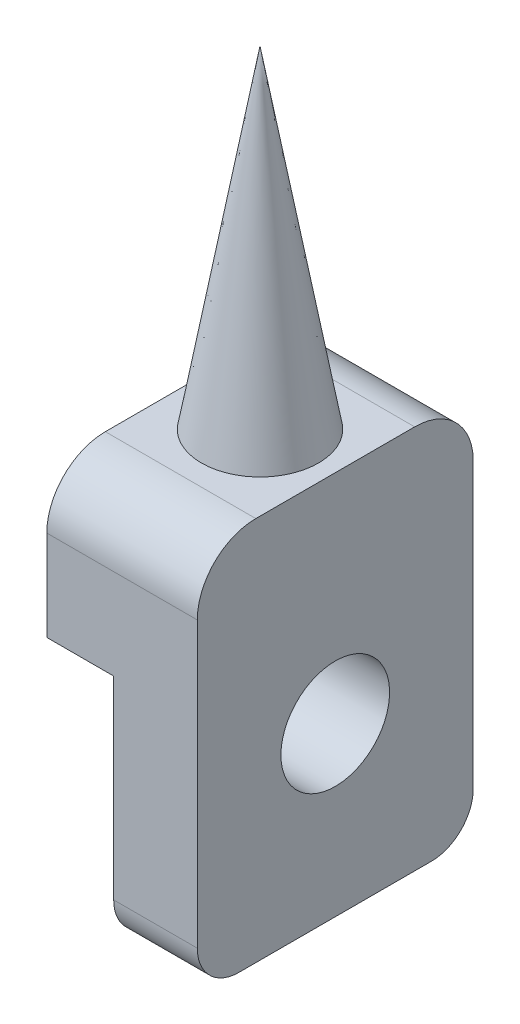
ISO-10303-21;
HEADER;
FILE_DESCRIPTION(('STEP AP214'),'2;1');
FILE_NAME('part.step','',(''),(''),'','','');
FILE_SCHEMA(('AUTOMOTIVE_DESIGN { 1 0 10303 214 1 1 1 1 }'));
ENDSEC;
DATA;
#1=APPLICATION_CONTEXT('core data for automotive mechanical design processes');
#2=APPLICATION_PROTOCOL_DEFINITION('international standard','automotive_design',2000,#1);
#3=PRODUCT_CONTEXT('',#1,'mechanical');
#4=PRODUCT('Part','Part','',(#3));
#5=PRODUCT_RELATED_PRODUCT_CATEGORY('part','',(#4));
#6=PRODUCT_DEFINITION_FORMATION('','',#4);
#7=PRODUCT_DEFINITION_CONTEXT('part definition',#1,'design');
#8=PRODUCT_DEFINITION('design','',#6,#7);
#9=PRODUCT_DEFINITION_SHAPE('','',#8);
#10=(LENGTH_UNIT() NAMED_UNIT(*) SI_UNIT(.MILLI.,.METRE.));
#11=(NAMED_UNIT(*) PLANE_ANGLE_UNIT() SI_UNIT($,.RADIAN.));
#12=(NAMED_UNIT(*) SI_UNIT($,.STERADIAN.) SOLID_ANGLE_UNIT());
#13=UNCERTAINTY_MEASURE_WITH_UNIT(LENGTH_MEASURE(1.E-05),#10,'distance_accuracy_value','');
#14=(GEOMETRIC_REPRESENTATION_CONTEXT(3) GLOBAL_UNCERTAINTY_ASSIGNED_CONTEXT((#13)) GLOBAL_UNIT_ASSIGNED_CONTEXT((#10,
#11,#12)) REPRESENTATION_CONTEXT('',''));
#15=CARTESIAN_POINT('',(0.,0.,0.));
#16=DIRECTION('',(0.,0.,1.));
#17=DIRECTION('',(1.,0.,0.));
#18=AXIS2_PLACEMENT_3D('',#15,#16,#17);
#19=CARTESIAN_POINT('',(-9.,46.,16.5));
#20=DIRECTION('',(0.,0.,-1.));
#21=DIRECTION('',(-1.,0.,0.));
#22=AXIS2_PLACEMENT_3D('',#19,#20,#21);
#23=PLANE('',#22);
#24=DIRECTION('',(0.,-1.,0.));
#25=VECTOR('',#24,1.);
#26=CARTESIAN_POINT('',(-9.,46.,16.5));
#27=LINE('',#26,#25);
#28=CARTESIAN_POINT('',(-9.,39.,16.5));
#29=VERTEX_POINT('',#28);
#30=CARTESIAN_POINT('',(-9.,28.1853527718724,16.5));
#31=VERTEX_POINT('',#30);
#32=EDGE_CURVE('E152',#29,#31,#27,.T.);
#33=ORIENTED_EDGE('',*,*,#32,.T.);
#34=DIRECTION('',(-1.,0.,0.));
#35=VECTOR('',#34,1.);
#36=CARTESIAN_POINT('',(-0.999999999999999,28.1853527718724,16.5));
#37=LINE('',#36,#35);
#38=CARTESIAN_POINT('',(-0.999999999999999,28.1853527718724,16.5));
#39=VERTEX_POINT('',#38);
#40=EDGE_CURVE('E143',#39,#31,#37,.T.);
#41=ORIENTED_EDGE('',*,*,#40,.F.);
#42=DIRECTION('',(0.,1.,0.));
#43=VECTOR('',#42,1.);
#44=CARTESIAN_POINT('',(-0.999999999999997,0.,16.5));
#45=LINE('',#44,#43);
#46=CARTESIAN_POINT('',(-0.999999999999998,5.,16.5));
#47=VERTEX_POINT('',#46);
#48=EDGE_CURVE('E124',#47,#39,#45,.T.);
#49=ORIENTED_EDGE('',*,*,#48,.F.);
#50=DIRECTION('',(1.,0.,0.));
#51=VECTOR('',#50,1.);
#52=CARTESIAN_POINT('',(-9.,5.,16.5));
#53=LINE('',#52,#51);
#54=CARTESIAN_POINT('',(9.,5.,16.5));
#55=VERTEX_POINT('',#54);
#56=EDGE_CURVE('E221',#47,#55,#53,.T.);
#57=ORIENTED_EDGE('',*,*,#56,.T.);
#58=DIRECTION('',(0.,-1.,0.));
#59=VECTOR('',#58,1.);
#60=CARTESIAN_POINT('',(9.,46.,16.5));
#61=LINE('',#60,#59);
#62=CARTESIAN_POINT('',(9.,39.,16.5));
#63=VERTEX_POINT('',#62);
#64=EDGE_CURVE('E184',#63,#55,#61,.T.);
#65=ORIENTED_EDGE('',*,*,#64,.F.);
#66=DIRECTION('',(1.,0.,0.));
#67=VECTOR('',#66,1.);
#68=CARTESIAN_POINT('',(-9.,39.,16.5));
#69=LINE('',#68,#67);
#70=EDGE_CURVE('E11',#63,#29,#69,.F.);
#71=ORIENTED_EDGE('',*,*,#70,.T.);
#72=EDGE_LOOP('',(#33,#41,#49,#57,#65,#71));
#73=FACE_BOUND('',#72,.T.);
#74=ADVANCED_FACE('F43',(#73),#23,.F.);
#75=CARTESIAN_POINT('',(0.,0.,0.));
#76=DIRECTION('',(0.,1.,0.));
#77=DIRECTION('',(0.,0.,1.));
#78=AXIS2_PLACEMENT_3D('',#75,#76,#77);
#79=PLANE('',#78);
#80=DIRECTION('',(0.,0.,1.));
#81=VECTOR('',#80,1.);
#82=CARTESIAN_POINT('',(-1.,0.,-16.5));
#83=LINE('',#82,#81);
#84=CARTESIAN_POINT('',(-1.,0.,-11.5));
#85=VERTEX_POINT('',#84);
#86=CARTESIAN_POINT('',(-0.999999999999999,0.,11.5));
#87=VERTEX_POINT('',#86);
#88=EDGE_CURVE('E138',#85,#87,#83,.T.);
#89=ORIENTED_EDGE('',*,*,#88,.F.);
#90=DIRECTION('',(-1.,0.,0.));
#91=VECTOR('',#90,1.);
#92=CARTESIAN_POINT('',(0.,0.,-11.5));
#93=LINE('',#92,#91);
#94=CARTESIAN_POINT('',(9.,0.,-11.5));
#95=VERTEX_POINT('',#94);
#96=EDGE_CURVE('E211',#85,#95,#93,.F.);
#97=ORIENTED_EDGE('',*,*,#96,.T.);
#98=DIRECTION('',(0.,0.,-1.));
#99=VECTOR('',#98,1.);
#100=CARTESIAN_POINT('',(9.,0.,-16.5));
#101=LINE('',#100,#99);
#102=CARTESIAN_POINT('',(9.,0.,11.5));
#103=VERTEX_POINT('',#102);
#104=EDGE_CURVE('E175',#103,#95,#101,.T.);
#105=ORIENTED_EDGE('',*,*,#104,.F.);
#106=DIRECTION('',(1.,0.,0.));
#107=VECTOR('',#106,1.);
#108=CARTESIAN_POINT('',(0.,0.,11.5));
#109=LINE('',#108,#107);
#110=EDGE_CURVE('E208',#103,#87,#109,.F.);
#111=ORIENTED_EDGE('',*,*,#110,.T.);
#112=EDGE_LOOP('',(#89,#97,#105,#111));
#113=FACE_BOUND('',#112,.T.);
#114=ADVANCED_FACE('F259',(#113),#79,.F.);
#115=CARTESIAN_POINT('',(9.,46.,-16.5));
#116=DIRECTION('',(-1.,0.,0.));
#117=DIRECTION('',(0.,0.,1.));
#118=AXIS2_PLACEMENT_3D('',#115,#116,#117);
#119=PLANE('',#118);
#120=CARTESIAN_POINT('',(9.,20.,0.));
#121=DIRECTION('',(-1.,0.,0.));
#122=DIRECTION('',(0.,0.,1.));
#123=AXIS2_PLACEMENT_3D('',#120,#121,#122);
#124=CIRCLE('',#123,6.5);
#125=CARTESIAN_POINT('',(9.,20.,6.49999999999999));
#126=VERTEX_POINT('',#125);
#127=EDGE_CURVE('E160',#126,#126,#124,.T.);
#128=ORIENTED_EDGE('',*,*,#127,.T.);
#129=EDGE_LOOP('',(#128));
#130=FACE_BOUND('',#129,.T.);
#131=DIRECTION('',(0.,-1.,0.));
#132=VECTOR('',#131,1.);
#133=CARTESIAN_POINT('',(9.,46.,-16.5));
#134=LINE('',#133,#132);
#135=CARTESIAN_POINT('',(9.,39.,-16.5));
#136=VERTEX_POINT('',#135);
#137=CARTESIAN_POINT('',(9.,5.,-16.5));
#138=VERTEX_POINT('',#137);
#139=EDGE_CURVE('E196',#136,#138,#134,.T.);
#140=ORIENTED_EDGE('',*,*,#139,.F.);
#141=CARTESIAN_POINT('',(9.,39.,-9.50000000000001));
#142=DIRECTION('',(-1.,0.,0.));
#143=DIRECTION('',(0.,0.,1.));
#144=AXIS2_PLACEMENT_3D('',#141,#142,#143);
#145=CIRCLE('',#144,7.);
#146=CARTESIAN_POINT('',(9.,46.,-9.50000000000001));
#147=VERTEX_POINT('',#146);
#148=EDGE_CURVE('E52',#136,#147,#145,.F.);
#149=ORIENTED_EDGE('',*,*,#148,.T.);
#150=DIRECTION('',(0.,0.,-1.));
#151=VECTOR('',#150,1.);
#152=CARTESIAN_POINT('',(9.,46.,-16.5));
#153=LINE('',#152,#151);
#154=CARTESIAN_POINT('',(9.,46.,9.5));
#155=VERTEX_POINT('',#154);
#156=EDGE_CURVE('E176',#155,#147,#153,.T.);
#157=ORIENTED_EDGE('',*,*,#156,.F.);
#158=CARTESIAN_POINT('',(9.,39.,9.5));
#159=DIRECTION('',(-1.,0.,0.));
#160=DIRECTION('',(0.,0.,1.));
#161=AXIS2_PLACEMENT_3D('',#158,#159,#160);
#162=CIRCLE('',#161,7.);
#163=EDGE_CURVE('E59',#155,#63,#162,.F.);
#164=ORIENTED_EDGE('',*,*,#163,.T.);
#165=ORIENTED_EDGE('',*,*,#64,.T.);
#166=CARTESIAN_POINT('',(9.,5.,11.5));
#167=DIRECTION('',(-1.,0.,0.));
#168=DIRECTION('',(0.,0.,1.));
#169=AXIS2_PLACEMENT_3D('',#166,#167,#168);
#170=CIRCLE('',#169,5.);
#171=EDGE_CURVE('E214',#55,#103,#170,.F.);
#172=ORIENTED_EDGE('',*,*,#171,.T.);
#173=ORIENTED_EDGE('',*,*,#104,.T.);
#174=CARTESIAN_POINT('',(9.,5.,-11.5));
#175=DIRECTION('',(-1.,0.,0.));
#176=DIRECTION('',(0.,0.,1.));
#177=AXIS2_PLACEMENT_3D('',#174,#175,#176);
#178=CIRCLE('',#177,5.);
#179=EDGE_CURVE('E217',#95,#138,#178,.F.);
#180=ORIENTED_EDGE('',*,*,#179,.T.);
#181=EDGE_LOOP('',(#140,#149,#157,#164,#165,#172,#173,#180));
#182=FACE_BOUND('',#181,.T.);
#183=ADVANCED_FACE('F243',(#130,#182),#119,.F.);
#184=CARTESIAN_POINT('',(-9.,46.,-16.5));
#185=DIRECTION('',(0.,0.,1.));
#186=DIRECTION('',(1.,0.,0.));
#187=AXIS2_PLACEMENT_3D('',#184,#185,#186);
#188=PLANE('',#187);
#189=DIRECTION('',(0.,-1.,0.));
#190=VECTOR('',#189,1.);
#191=CARTESIAN_POINT('',(-1.,0.,-16.5));
#192=LINE('',#191,#190);
#193=CARTESIAN_POINT('',(-1.,28.1853527718725,-16.5));
#194=VERTEX_POINT('',#193);
#195=CARTESIAN_POINT('',(-1.,5.,-16.5));
#196=VERTEX_POINT('',#195);
#197=EDGE_CURVE('E164',#194,#196,#192,.T.);
#198=ORIENTED_EDGE('',*,*,#197,.F.);
#199=DIRECTION('',(-1.,0.,0.));
#200=VECTOR('',#199,1.);
#201=CARTESIAN_POINT('',(-1.,28.1853527718725,-16.5));
#202=LINE('',#201,#200);
#203=CARTESIAN_POINT('',(-9.,28.1853527718725,-16.5));
#204=VERTEX_POINT('',#203);
#205=EDGE_CURVE('E146',#194,#204,#202,.T.);
#206=ORIENTED_EDGE('',*,*,#205,.T.);
#207=DIRECTION('',(0.,-1.,0.));
#208=VECTOR('',#207,1.);
#209=CARTESIAN_POINT('',(-9.,46.,-16.5));
#210=LINE('',#209,#208);
#211=CARTESIAN_POINT('',(-9.,39.,-16.5));
#212=VERTEX_POINT('',#211);
#213=EDGE_CURVE('E192',#212,#204,#210,.T.);
#214=ORIENTED_EDGE('',*,*,#213,.F.);
#215=DIRECTION('',(-1.,0.,0.));
#216=VECTOR('',#215,1.);
#217=CARTESIAN_POINT('',(9.,39.,-16.5));
#218=LINE('',#217,#216);
#219=EDGE_CURVE('E67',#212,#136,#218,.F.);
#220=ORIENTED_EDGE('',*,*,#219,.T.);
#221=ORIENTED_EDGE('',*,*,#139,.T.);
#222=DIRECTION('',(-1.,0.,0.));
#223=VECTOR('',#222,1.);
#224=CARTESIAN_POINT('',(-9.,5.,-16.5));
#225=LINE('',#224,#223);
#226=EDGE_CURVE('E199',#138,#196,#225,.T.);
#227=ORIENTED_EDGE('',*,*,#226,.T.);
#228=EDGE_LOOP('',(#198,#206,#214,#220,#221,#227));
#229=FACE_BOUND('',#228,.T.);
#230=ADVANCED_FACE('F253',(#229),#188,.F.);
#231=CARTESIAN_POINT('',(-9.,46.,-16.5));
#232=DIRECTION('',(1.,0.,0.));
#233=DIRECTION('',(0.,0.,-1.));
#234=AXIS2_PLACEMENT_3D('',#231,#232,#233);
#235=PLANE('',#234);
#236=ORIENTED_EDGE('',*,*,#213,.T.);
#237=CARTESIAN_POINT('',(-9.,24.0926763859362,0.));
#238=DIRECTION('',(-1.,0.,0.));
#239=DIRECTION('',(0.,0.,-1.));
#240=AXIS2_PLACEMENT_3D('',#237,#238,#239);
#241=CIRCLE('',#240,17.);
#242=EDGE_CURVE('E148',#31,#204,#241,.T.);
#243=ORIENTED_EDGE('',*,*,#242,.F.);
#244=ORIENTED_EDGE('',*,*,#32,.F.);
#245=CARTESIAN_POINT('',(-9.,39.,9.5));
#246=DIRECTION('',(1.,0.,0.));
#247=DIRECTION('',(0.,0.,-1.));
#248=AXIS2_PLACEMENT_3D('',#245,#246,#247);
#249=CIRCLE('',#248,7.);
#250=CARTESIAN_POINT('',(-9.,46.,9.5));
#251=VERTEX_POINT('',#250);
#252=EDGE_CURVE('E232',#29,#251,#249,.F.);
#253=ORIENTED_EDGE('',*,*,#252,.T.);
#254=DIRECTION('',(0.,0.,1.));
#255=VECTOR('',#254,1.);
#256=CARTESIAN_POINT('',(-9.,46.,-16.5));
#257=LINE('',#256,#255);
#258=CARTESIAN_POINT('',(-9.,46.,-9.50000000000001));
#259=VERTEX_POINT('',#258);
#260=EDGE_CURVE('E180',#259,#251,#257,.T.);
#261=ORIENTED_EDGE('',*,*,#260,.F.);
#262=CARTESIAN_POINT('',(-9.,39.,-9.50000000000001));
#263=DIRECTION('',(1.,0.,0.));
#264=DIRECTION('',(0.,0.,-1.));
#265=AXIS2_PLACEMENT_3D('',#262,#263,#264);
#266=CIRCLE('',#265,7.);
#267=EDGE_CURVE('E235',#259,#212,#266,.F.);
#268=ORIENTED_EDGE('',*,*,#267,.T.);
#269=EDGE_LOOP('',(#236,#243,#244,#253,#261,#268));
#270=FACE_BOUND('',#269,.T.);
#271=ADVANCED_FACE('F252',(#270),#235,.F.);
#272=CARTESIAN_POINT('',(0.,46.,0.));
#273=DIRECTION('',(0.,1.,0.));
#274=DIRECTION('',(0.,0.,1.));
#275=AXIS2_PLACEMENT_3D('',#272,#273,#274);
#276=PLANE('',#275);
#277=CARTESIAN_POINT('',(0.,46.,0.));
#278=DIRECTION('',(0.,1.,0.));
#279=DIRECTION('',(0.,0.,1.));
#280=AXIS2_PLACEMENT_3D('',#277,#278,#279);
#281=CIRCLE('',#280,7.);
#282=CARTESIAN_POINT('',(0.,46.,7.));
#283=VERTEX_POINT('',#282);
#284=EDGE_CURVE('E137',#283,#283,#281,.T.);
#285=ORIENTED_EDGE('',*,*,#284,.F.);
#286=EDGE_LOOP('',(#285));
#287=FACE_BOUND('',#286,.T.);
#288=ORIENTED_EDGE('',*,*,#156,.T.);
#289=DIRECTION('',(-1.,0.,0.));
#290=VECTOR('',#289,1.);
#291=CARTESIAN_POINT('',(-9.,46.,-9.50000000000001));
#292=LINE('',#291,#290);
#293=EDGE_CURVE('E228',#147,#259,#292,.T.);
#294=ORIENTED_EDGE('',*,*,#293,.T.);
#295=ORIENTED_EDGE('',*,*,#260,.T.);
#296=DIRECTION('',(1.,0.,0.));
#297=VECTOR('',#296,1.);
#298=CARTESIAN_POINT('',(9.,46.,9.5));
#299=LINE('',#298,#297);
#300=EDGE_CURVE('E224',#251,#155,#299,.T.);
#301=ORIENTED_EDGE('',*,*,#300,.T.);
#302=EDGE_LOOP('',(#288,#294,#295,#301));
#303=FACE_BOUND('',#302,.T.);
#304=ADVANCED_FACE('F247',(#287,#303),#276,.T.);
#305=CARTESIAN_POINT('',(0.,46.,0.));
#306=DIRECTION('',(0.,-1.,0.));
#307=DIRECTION('',(0.,0.,1.));
#308=AXIS2_PLACEMENT_3D('',#305,#306,#307);
#309=CONICAL_SURFACE('',#308,7.,0.174532925199433);
#310=CARTESIAN_POINT('',(0.,85.6989727373239,0.));
#311=VERTEX_POINT('',#310);
#312=VERTEX_LOOP('',#311);
#313=FACE_BOUND('',#312,.T.);
#314=ORIENTED_EDGE('',*,*,#284,.T.);
#315=EDGE_LOOP('',(#314));
#316=FACE_BOUND('',#315,.T.);
#317=ADVANCED_FACE('F346',(#313,#316),#309,.T.);
#318=CARTESIAN_POINT('',(-1.,20.,0.));
#319=DIRECTION('',(-1.,0.,0.));
#320=DIRECTION('',(0.,0.,1.));
#321=AXIS2_PLACEMENT_3D('',#318,#319,#320);
#322=PLANE('',#321);
#323=CARTESIAN_POINT('',(-1.,20.,0.));
#324=DIRECTION('',(-1.,0.,0.));
#325=DIRECTION('',(0.,0.,1.));
#326=AXIS2_PLACEMENT_3D('',#323,#324,#325);
#327=CIRCLE('',#326,6.5);
#328=CARTESIAN_POINT('',(-1.,20.,6.49999999999999));
#329=VERTEX_POINT('',#328);
#330=EDGE_CURVE('E156',#329,#329,#327,.T.);
#331=ORIENTED_EDGE('',*,*,#330,.F.);
#332=EDGE_LOOP('',(#331));
#333=FACE_BOUND('',#332,.T.);
#334=ORIENTED_EDGE('',*,*,#48,.T.);
#335=CARTESIAN_POINT('',(-1.,24.0926763859362,0.));
#336=DIRECTION('',(-1.,0.,0.));
#337=DIRECTION('',(0.,0.,-1.));
#338=AXIS2_PLACEMENT_3D('',#335,#336,#337);
#339=CIRCLE('',#338,17.);
#340=EDGE_CURVE('E128',#39,#194,#339,.T.);
#341=ORIENTED_EDGE('',*,*,#340,.T.);
#342=ORIENTED_EDGE('',*,*,#197,.T.);
#343=CARTESIAN_POINT('',(-1.,5.,-11.5));
#344=DIRECTION('',(-1.,0.,0.));
#345=DIRECTION('',(0.,0.,1.));
#346=AXIS2_PLACEMENT_3D('',#343,#344,#345);
#347=CIRCLE('',#346,5.);
#348=EDGE_CURVE('E205',#196,#85,#347,.T.);
#349=ORIENTED_EDGE('',*,*,#348,.T.);
#350=ORIENTED_EDGE('',*,*,#88,.T.);
#351=CARTESIAN_POINT('',(-0.999999999999999,5.,11.5));
#352=DIRECTION('',(-1.,0.,0.));
#353=DIRECTION('',(0.,0.,1.));
#354=AXIS2_PLACEMENT_3D('',#351,#352,#353);
#355=CIRCLE('',#354,5.);
#356=EDGE_CURVE('E131',#87,#47,#355,.T.);
#357=ORIENTED_EDGE('',*,*,#356,.T.);
#358=EDGE_LOOP('',(#334,#341,#342,#349,#350,#357));
#359=FACE_BOUND('',#358,.T.);
#360=ADVANCED_FACE('F126',(#333,#359),#322,.T.);
#361=CARTESIAN_POINT('',(9.,20.,0.));
#362=DIRECTION('',(-1.,0.,0.));
#363=DIRECTION('',(0.,0.,1.));
#364=AXIS2_PLACEMENT_3D('',#361,#362,#363);
#365=CYLINDRICAL_SURFACE('',#364,6.5);
#366=ORIENTED_EDGE('',*,*,#127,.F.);
#367=EDGE_LOOP('',(#366));
#368=FACE_BOUND('',#367,.T.);
#369=ORIENTED_EDGE('',*,*,#330,.T.);
#370=EDGE_LOOP('',(#369));
#371=FACE_BOUND('',#370,.T.);
#372=ADVANCED_FACE('F294',(#368,#371),#365,.F.);
#373=CARTESIAN_POINT('',(-9.,5.,-11.5));
#374=DIRECTION('',(-1.,0.,0.));
#375=DIRECTION('',(0.,0.,1.));
#376=AXIS2_PLACEMENT_3D('',#373,#374,#375);
#377=CYLINDRICAL_SURFACE('',#376,5.);
#378=ORIENTED_EDGE('',*,*,#179,.F.);
#379=ORIENTED_EDGE('',*,*,#96,.F.);
#380=ORIENTED_EDGE('',*,*,#348,.F.);
#381=ORIENTED_EDGE('',*,*,#226,.F.);
#382=EDGE_LOOP('',(#378,#379,#380,#381));
#383=FACE_BOUND('',#382,.T.);
#384=ADVANCED_FACE('F263',(#383),#377,.T.);
#385=CARTESIAN_POINT('',(-9.,5.,11.5));
#386=DIRECTION('',(1.,0.,0.));
#387=DIRECTION('',(0.,0.,-1.));
#388=AXIS2_PLACEMENT_3D('',#385,#386,#387);
#389=CYLINDRICAL_SURFACE('',#388,5.);
#390=ORIENTED_EDGE('',*,*,#356,.F.);
#391=ORIENTED_EDGE('',*,*,#110,.F.);
#392=ORIENTED_EDGE('',*,*,#171,.F.);
#393=ORIENTED_EDGE('',*,*,#56,.F.);
#394=EDGE_LOOP('',(#390,#391,#392,#393));
#395=FACE_BOUND('',#394,.T.);
#396=ADVANCED_FACE('F266',(#395),#389,.T.);
#397=CARTESIAN_POINT('',(0.,39.,-9.50000000000001));
#398=DIRECTION('',(1.,0.,0.));
#399=DIRECTION('',(0.,0.,-1.));
#400=AXIS2_PLACEMENT_3D('',#397,#398,#399);
#401=CYLINDRICAL_SURFACE('',#400,7.);
#402=ORIENTED_EDGE('',*,*,#148,.F.);
#403=ORIENTED_EDGE('',*,*,#219,.F.);
#404=ORIENTED_EDGE('',*,*,#267,.F.);
#405=ORIENTED_EDGE('',*,*,#293,.F.);
#406=EDGE_LOOP('',(#402,#403,#404,#405));
#407=FACE_BOUND('',#406,.T.);
#408=ADVANCED_FACE('F250',(#407),#401,.T.);
#409=CARTESIAN_POINT('',(0.,39.,9.5));
#410=DIRECTION('',(-1.,0.,0.));
#411=DIRECTION('',(0.,0.,1.));
#412=AXIS2_PLACEMENT_3D('',#409,#410,#411);
#413=CYLINDRICAL_SURFACE('',#412,7.);
#414=ORIENTED_EDGE('',*,*,#252,.F.);
#415=ORIENTED_EDGE('',*,*,#70,.F.);
#416=ORIENTED_EDGE('',*,*,#163,.F.);
#417=ORIENTED_EDGE('',*,*,#300,.F.);
#418=EDGE_LOOP('',(#414,#415,#416,#417));
#419=FACE_BOUND('',#418,.T.);
#420=ADVANCED_FACE('F45',(#419),#413,.T.);
#421=CARTESIAN_POINT('',(-1.,24.0926763859362,0.));
#422=DIRECTION('',(-1.,0.,0.));
#423=DIRECTION('',(0.,0.,1.));
#424=AXIS2_PLACEMENT_3D('',#421,#422,#423);
#425=CYLINDRICAL_SURFACE('',#424,17.);
#426=ORIENTED_EDGE('',*,*,#242,.T.);
#427=ORIENTED_EDGE('',*,*,#205,.F.);
#428=ORIENTED_EDGE('',*,*,#340,.F.);
#429=ORIENTED_EDGE('',*,*,#40,.T.);
#430=EDGE_LOOP('',(#426,#427,#428,#429));
#431=FACE_BOUND('',#430,.T.);
#432=ADVANCED_FACE('F142',(#431),#425,.F.);
#433=CLOSED_SHELL('',(#74,#114,#183,#230,#271,#304,#317,#360,#372,#384,#396,#408,#420,#432));
#434=MANIFOLD_SOLID_BREP('B2',#433);
#435=ADVANCED_BREP_SHAPE_REPRESENTATION('',(#18,#434),#14);
#436=SHAPE_DEFINITION_REPRESENTATION(#9,#435);
ENDSEC;
END-ISO-10303-21;
